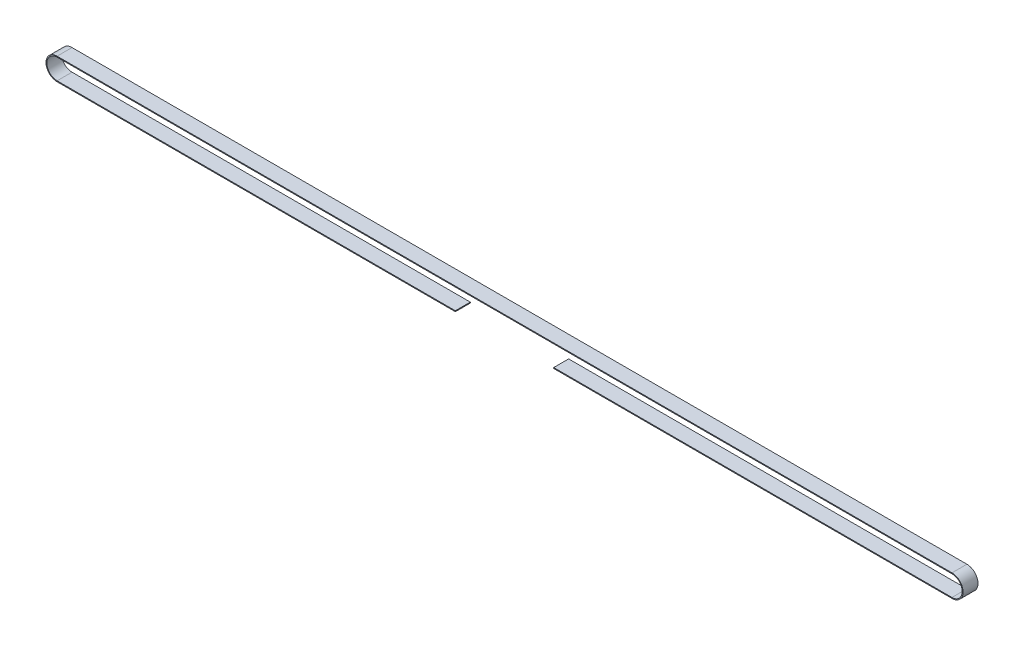
ISO-10303-21;
HEADER;
FILE_DESCRIPTION(('STEP AP214'),'2;1');
FILE_NAME('part.step','',(''),(''),'','','');
FILE_SCHEMA(('AUTOMOTIVE_DESIGN { 1 0 10303 214 1 1 1 1 }'));
ENDSEC;
DATA;
#1=APPLICATION_CONTEXT('core data for automotive mechanical design processes');
#2=APPLICATION_PROTOCOL_DEFINITION('international standard','automotive_design',2000,#1);
#3=PRODUCT_CONTEXT('',#1,'mechanical');
#4=PRODUCT('Part','Part','',(#3));
#5=PRODUCT_RELATED_PRODUCT_CATEGORY('part','',(#4));
#6=PRODUCT_DEFINITION_FORMATION('','',#4);
#7=PRODUCT_DEFINITION_CONTEXT('part definition',#1,'design');
#8=PRODUCT_DEFINITION('design','',#6,#7);
#9=PRODUCT_DEFINITION_SHAPE('','',#8);
#10=(LENGTH_UNIT() NAMED_UNIT(*) SI_UNIT(.MILLI.,.METRE.));
#11=(NAMED_UNIT(*) PLANE_ANGLE_UNIT() SI_UNIT($,.RADIAN.));
#12=(NAMED_UNIT(*) SI_UNIT($,.STERADIAN.) SOLID_ANGLE_UNIT());
#13=UNCERTAINTY_MEASURE_WITH_UNIT(LENGTH_MEASURE(1.E-05),#10,'distance_accuracy_value','');
#14=(GEOMETRIC_REPRESENTATION_CONTEXT(3) GLOBAL_UNCERTAINTY_ASSIGNED_CONTEXT((#13)) GLOBAL_UNIT_ASSIGNED_CONTEXT((#10,
#11,#12)) REPRESENTATION_CONTEXT('',''));
#15=CARTESIAN_POINT('',(0.,0.,0.));
#16=DIRECTION('',(0.,0.,1.));
#17=DIRECTION('',(1.,0.,0.));
#18=AXIS2_PLACEMENT_3D('',#15,#16,#17);
#19=CARTESIAN_POINT('',(-254.75,-6.32000000000019,4.25));
#20=DIRECTION('',(0.,1.,0.));
#21=DIRECTION('',(0.,0.,1.));
#22=AXIS2_PLACEMENT_3D('',#19,#20,#21);
#23=PLANE('',#22);
#24=DIRECTION('',(1.,0.,0.));
#25=VECTOR('',#24,1.);
#26=CARTESIAN_POINT('',(-254.75,-6.32000000000019,-4.25));
#27=LINE('',#26,#25);
#28=CARTESIAN_POINT('',(-254.75,-6.32000000000019,-4.25));
#29=VERTEX_POINT('',#28);
#30=CARTESIAN_POINT('',(-28.,-6.32000000000019,-4.25));
#31=VERTEX_POINT('',#30);
#32=EDGE_CURVE('E144',#29,#31,#27,.T.);
#33=ORIENTED_EDGE('',*,*,#32,.T.);
#34=DIRECTION('',(0.,0.,1.));
#35=VECTOR('',#34,1.);
#36=CARTESIAN_POINT('',(-28.,-6.32000000000019,4.25));
#37=LINE('',#36,#35);
#38=CARTESIAN_POINT('',(-28.,-6.32000000000019,4.25));
#39=VERTEX_POINT('',#38);
#40=EDGE_CURVE('E55',#31,#39,#37,.T.);
#41=ORIENTED_EDGE('',*,*,#40,.T.);
#42=DIRECTION('',(1.,0.,0.));
#43=VECTOR('',#42,1.);
#44=CARTESIAN_POINT('',(-254.75,-6.32000000000019,4.25));
#45=LINE('',#44,#43);
#46=CARTESIAN_POINT('',(-254.75,-6.32000000000019,4.25));
#47=VERTEX_POINT('',#46);
#48=EDGE_CURVE('E143',#47,#39,#45,.T.);
#49=ORIENTED_EDGE('',*,*,#48,.F.);
#50=DIRECTION('',(0.,0.,1.));
#51=VECTOR('',#50,1.);
#52=CARTESIAN_POINT('',(-254.75,-6.32000000000019,4.25));
#53=LINE('',#52,#51);
#54=EDGE_CURVE('E225',#29,#47,#53,.T.);
#55=ORIENTED_EDGE('',*,*,#54,.F.);
#56=EDGE_LOOP('',(#33,#41,#49,#55));
#57=FACE_BOUND('',#56,.T.);
#58=ADVANCED_FACE('F33',(#57),#23,.F.);
#59=CARTESIAN_POINT('',(-254.75,-5.82000000000019,4.25));
#60=DIRECTION('',(0.,-1.,0.));
#61=DIRECTION('',(0.,0.,-1.));
#62=AXIS2_PLACEMENT_3D('',#59,#60,#61);
#63=PLANE('',#62);
#64=DIRECTION('',(1.,0.,0.));
#65=VECTOR('',#64,1.);
#66=CARTESIAN_POINT('',(-254.75,-5.82000000000019,4.25));
#67=LINE('',#66,#65);
#68=CARTESIAN_POINT('',(-254.75,-5.82000000000019,4.25));
#69=VERTEX_POINT('',#68);
#70=CARTESIAN_POINT('',(-28.,-5.82000000000019,4.25));
#71=VERTEX_POINT('',#70);
#72=EDGE_CURVE('E206',#69,#71,#67,.T.);
#73=ORIENTED_EDGE('',*,*,#72,.T.);
#74=DIRECTION('',(0.,0.,-1.));
#75=VECTOR('',#74,1.);
#76=CARTESIAN_POINT('',(-28.,-5.82000000000019,4.25));
#77=LINE('',#76,#75);
#78=CARTESIAN_POINT('',(-28.,-5.82000000000019,-4.25));
#79=VERTEX_POINT('',#78);
#80=EDGE_CURVE('E126',#71,#79,#77,.T.);
#81=ORIENTED_EDGE('',*,*,#80,.T.);
#82=DIRECTION('',(1.,0.,0.));
#83=VECTOR('',#82,1.);
#84=CARTESIAN_POINT('',(-254.75,-5.82000000000019,-4.25));
#85=LINE('',#84,#83);
#86=CARTESIAN_POINT('',(-254.75,-5.82000000000019,-4.25));
#87=VERTEX_POINT('',#86);
#88=EDGE_CURVE('E205',#87,#79,#85,.T.);
#89=ORIENTED_EDGE('',*,*,#88,.F.);
#90=DIRECTION('',(0.,0.,-1.));
#91=VECTOR('',#90,1.);
#92=CARTESIAN_POINT('',(-254.75,-5.82000000000019,4.25));
#93=LINE('',#92,#91);
#94=EDGE_CURVE('E171',#69,#87,#93,.T.);
#95=ORIENTED_EDGE('',*,*,#94,.F.);
#96=EDGE_LOOP('',(#73,#81,#89,#95));
#97=FACE_BOUND('',#96,.T.);
#98=ADVANCED_FACE('F248',(#97),#63,.F.);
#99=CARTESIAN_POINT('',(254.75,0.,0.));
#100=DIRECTION('',(0.,0.,1.));
#101=DIRECTION('',(1.,0.,0.));
#102=AXIS2_PLACEMENT_3D('',#99,#100,#101);
#103=CYLINDRICAL_SURFACE('',#102,6.32000000000019);
#104=DIRECTION('',(0.,0.,1.));
#105=VECTOR('',#104,1.);
#106=CARTESIAN_POINT('',(254.75,-6.32000000000019,4.25));
#107=LINE('',#106,#105);
#108=CARTESIAN_POINT('',(254.75,-6.32000000000019,-4.25));
#109=VERTEX_POINT('',#108);
#110=CARTESIAN_POINT('',(254.75,-6.32000000000019,4.25));
#111=VERTEX_POINT('',#110);
#112=EDGE_CURVE('E142',#109,#111,#107,.T.);
#113=ORIENTED_EDGE('',*,*,#112,.F.);
#114=CARTESIAN_POINT('',(254.75,0.,-4.25));
#115=DIRECTION('',(0.,0.,1.));
#116=DIRECTION('',(1.,0.,0.));
#117=AXIS2_PLACEMENT_3D('',#114,#115,#116);
#118=CIRCLE('',#117,6.32000000000019);
#119=CARTESIAN_POINT('',(254.75,6.32000000000019,-4.25));
#120=VERTEX_POINT('',#119);
#121=EDGE_CURVE('E164',#109,#120,#118,.T.);
#122=ORIENTED_EDGE('',*,*,#121,.T.);
#123=DIRECTION('',(0.,0.,1.));
#124=VECTOR('',#123,1.);
#125=CARTESIAN_POINT('',(254.75,6.32000000000019,4.25));
#126=LINE('',#125,#124);
#127=CARTESIAN_POINT('',(254.75,6.32000000000019,4.25));
#128=VERTEX_POINT('',#127);
#129=EDGE_CURVE('E155',#120,#128,#126,.T.);
#130=ORIENTED_EDGE('',*,*,#129,.T.);
#131=CARTESIAN_POINT('',(254.75,0.,4.25));
#132=DIRECTION('',(0.,0.,1.));
#133=DIRECTION('',(1.,0.,0.));
#134=AXIS2_PLACEMENT_3D('',#131,#132,#133);
#135=CIRCLE('',#134,6.32000000000019);
#136=EDGE_CURVE('E167',#111,#128,#135,.T.);
#137=ORIENTED_EDGE('',*,*,#136,.F.);
#138=EDGE_LOOP('',(#113,#122,#130,#137));
#139=FACE_BOUND('',#138,.T.);
#140=ADVANCED_FACE('F35',(#139),#103,.T.);
#141=CARTESIAN_POINT('',(254.75,0.,0.));
#142=DIRECTION('',(0.,0.,1.));
#143=DIRECTION('',(1.,0.,0.));
#144=AXIS2_PLACEMENT_3D('',#141,#142,#143);
#145=CYLINDRICAL_SURFACE('',#144,5.82000000000019);
#146=DIRECTION('',(0.,0.,-1.));
#147=VECTOR('',#146,1.);
#148=CARTESIAN_POINT('',(254.75,-5.82000000000019,4.25));
#149=LINE('',#148,#147);
#150=CARTESIAN_POINT('',(254.75,-5.82000000000019,4.25));
#151=VERTEX_POINT('',#150);
#152=CARTESIAN_POINT('',(254.75,-5.82000000000019,-4.25));
#153=VERTEX_POINT('',#152);
#154=EDGE_CURVE('E212',#151,#153,#149,.T.);
#155=ORIENTED_EDGE('',*,*,#154,.F.);
#156=CARTESIAN_POINT('',(254.75,0.,4.25));
#157=DIRECTION('',(0.,0.,1.));
#158=DIRECTION('',(1.,0.,0.));
#159=AXIS2_PLACEMENT_3D('',#156,#157,#158);
#160=CIRCLE('',#159,5.82000000000019);
#161=CARTESIAN_POINT('',(254.75,5.82000000000019,4.25));
#162=VERTEX_POINT('',#161);
#163=EDGE_CURVE('E158',#151,#162,#160,.T.);
#164=ORIENTED_EDGE('',*,*,#163,.T.);
#165=DIRECTION('',(0.,0.,-1.));
#166=VECTOR('',#165,1.);
#167=CARTESIAN_POINT('',(254.75,5.82000000000019,4.25));
#168=LINE('',#167,#166);
#169=CARTESIAN_POINT('',(254.75,5.82000000000019,-4.25));
#170=VERTEX_POINT('',#169);
#171=EDGE_CURVE('E147',#162,#170,#168,.T.);
#172=ORIENTED_EDGE('',*,*,#171,.T.);
#173=CARTESIAN_POINT('',(254.75,0.,-4.25));
#174=DIRECTION('',(0.,0.,1.));
#175=DIRECTION('',(1.,0.,0.));
#176=AXIS2_PLACEMENT_3D('',#173,#174,#175);
#177=CIRCLE('',#176,5.82000000000019);
#178=EDGE_CURVE('E161',#153,#170,#177,.T.);
#179=ORIENTED_EDGE('',*,*,#178,.F.);
#180=EDGE_LOOP('',(#155,#164,#172,#179));
#181=FACE_BOUND('',#180,.T.);
#182=ADVANCED_FACE('F199',(#181),#145,.F.);
#183=CARTESIAN_POINT('',(28.,-6.32000000000019,4.25));
#184=VERTEX_POINT('',#183);
#185=EDGE_CURVE('E133',#184,#111,#45,.T.);
#186=ORIENTED_EDGE('',*,*,#185,.F.);
#187=DIRECTION('',(0.,0.,-1.));
#188=VECTOR('',#187,1.);
#189=CARTESIAN_POINT('',(28.,-6.32000000000019,4.25));
#190=LINE('',#189,#188);
#191=CARTESIAN_POINT('',(28.,-6.32000000000019,-4.25));
#192=VERTEX_POINT('',#191);
#193=EDGE_CURVE('E119',#184,#192,#190,.T.);
#194=ORIENTED_EDGE('',*,*,#193,.T.);
#195=EDGE_CURVE('E149',#192,#109,#27,.T.);
#196=ORIENTED_EDGE('',*,*,#195,.T.);
#197=ORIENTED_EDGE('',*,*,#112,.T.);
#198=EDGE_LOOP('',(#186,#194,#196,#197));
#199=FACE_BOUND('',#198,.T.);
#200=ADVANCED_FACE('F140',(#199),#23,.F.);
#201=CARTESIAN_POINT('',(28.,-5.82000000000019,-4.25));
#202=VERTEX_POINT('',#201);
#203=EDGE_CURVE('E203',#202,#153,#85,.T.);
#204=ORIENTED_EDGE('',*,*,#203,.F.);
#205=DIRECTION('',(0.,0.,1.));
#206=VECTOR('',#205,1.);
#207=CARTESIAN_POINT('',(28.,-5.82000000000019,4.25));
#208=LINE('',#207,#206);
#209=CARTESIAN_POINT('',(28.,-5.82000000000019,4.25));
#210=VERTEX_POINT('',#209);
#211=EDGE_CURVE('E48',#202,#210,#208,.T.);
#212=ORIENTED_EDGE('',*,*,#211,.T.);
#213=EDGE_CURVE('E136',#210,#151,#67,.T.);
#214=ORIENTED_EDGE('',*,*,#213,.T.);
#215=ORIENTED_EDGE('',*,*,#154,.T.);
#216=EDGE_LOOP('',(#204,#212,#214,#215));
#217=FACE_BOUND('',#216,.T.);
#218=ADVANCED_FACE('F260',(#217),#63,.F.);
#219=CARTESIAN_POINT('',(-254.75,0.,0.));
#220=DIRECTION('',(0.,0.,1.));
#221=DIRECTION('',(1.,0.,0.));
#222=AXIS2_PLACEMENT_3D('',#219,#220,#221);
#223=CYLINDRICAL_SURFACE('',#222,6.32000000000009);
#224=DIRECTION('',(0.,0.,1.));
#225=VECTOR('',#224,1.);
#226=CARTESIAN_POINT('',(-254.75,6.32,4.25));
#227=LINE('',#226,#225);
#228=CARTESIAN_POINT('',(-254.75,6.32,-4.25));
#229=VERTEX_POINT('',#228);
#230=CARTESIAN_POINT('',(-254.75,6.32,4.25));
#231=VERTEX_POINT('',#230);
#232=EDGE_CURVE('E178',#229,#231,#227,.T.);
#233=ORIENTED_EDGE('',*,*,#232,.F.);
#234=CARTESIAN_POINT('',(-254.75,0.,-4.25));
#235=DIRECTION('',(0.,0.,1.));
#236=DIRECTION('',(1.,0.,0.));
#237=AXIS2_PLACEMENT_3D('',#234,#235,#236);
#238=CIRCLE('',#237,6.32000000000009);
#239=EDGE_CURVE('E217',#229,#29,#238,.T.);
#240=ORIENTED_EDGE('',*,*,#239,.T.);
#241=ORIENTED_EDGE('',*,*,#54,.T.);
#242=CARTESIAN_POINT('',(-254.75,0.,4.25));
#243=DIRECTION('',(0.,0.,1.));
#244=DIRECTION('',(1.,0.,0.));
#245=AXIS2_PLACEMENT_3D('',#242,#243,#244);
#246=CIRCLE('',#245,6.32000000000009);
#247=EDGE_CURVE('E214',#231,#47,#246,.T.);
#248=ORIENTED_EDGE('',*,*,#247,.F.);
#249=EDGE_LOOP('',(#233,#240,#241,#248));
#250=FACE_BOUND('',#249,.T.);
#251=ADVANCED_FACE('F243',(#250),#223,.T.);
#252=CARTESIAN_POINT('',(-254.75,0.,0.));
#253=DIRECTION('',(0.,0.,1.));
#254=DIRECTION('',(1.,0.,0.));
#255=AXIS2_PLACEMENT_3D('',#252,#253,#254);
#256=CYLINDRICAL_SURFACE('',#255,5.82000000000009);
#257=DIRECTION('',(0.,0.,-1.));
#258=VECTOR('',#257,1.);
#259=CARTESIAN_POINT('',(-254.75,5.82,4.25));
#260=LINE('',#259,#258);
#261=CARTESIAN_POINT('',(-254.75,5.82,4.25));
#262=VERTEX_POINT('',#261);
#263=CARTESIAN_POINT('',(-254.75,5.82,-4.25));
#264=VERTEX_POINT('',#263);
#265=EDGE_CURVE('E193',#262,#264,#260,.T.);
#266=ORIENTED_EDGE('',*,*,#265,.F.);
#267=CARTESIAN_POINT('',(-254.75,0.,4.25));
#268=DIRECTION('',(0.,0.,1.));
#269=DIRECTION('',(1.,0.,0.));
#270=AXIS2_PLACEMENT_3D('',#267,#268,#269);
#271=CIRCLE('',#270,5.82000000000009);
#272=EDGE_CURVE('E222',#262,#69,#271,.T.);
#273=ORIENTED_EDGE('',*,*,#272,.T.);
#274=ORIENTED_EDGE('',*,*,#94,.T.);
#275=CARTESIAN_POINT('',(-254.75,0.,-4.25));
#276=DIRECTION('',(0.,0.,1.));
#277=DIRECTION('',(1.,0.,0.));
#278=AXIS2_PLACEMENT_3D('',#275,#276,#277);
#279=CIRCLE('',#278,5.82000000000009);
#280=EDGE_CURVE('E220',#264,#87,#279,.T.);
#281=ORIENTED_EDGE('',*,*,#280,.F.);
#282=EDGE_LOOP('',(#266,#273,#274,#281));
#283=FACE_BOUND('',#282,.T.);
#284=ADVANCED_FACE('F251',(#283),#256,.F.);
#285=CARTESIAN_POINT('',(-254.75,6.32,4.25));
#286=DIRECTION('',(0.,0.,1.));
#287=DIRECTION('',(1.,0.,0.));
#288=AXIS2_PLACEMENT_3D('',#285,#286,#287);
#289=PLANE('',#288);
#290=DIRECTION('',(0.,-1.,0.));
#291=VECTOR('',#290,1.);
#292=CARTESIAN_POINT('',(-28.,-40.,4.25));
#293=LINE('',#292,#291);
#294=EDGE_CURVE('E137',#71,#39,#293,.T.);
#295=ORIENTED_EDGE('',*,*,#294,.F.);
#296=ORIENTED_EDGE('',*,*,#72,.F.);
#297=ORIENTED_EDGE('',*,*,#272,.F.);
#298=DIRECTION('',(1.,0.,0.));
#299=VECTOR('',#298,1.);
#300=CARTESIAN_POINT('',(-254.75,5.82,4.25));
#301=LINE('',#300,#299);
#302=EDGE_CURVE('E175',#262,#162,#301,.T.);
#303=ORIENTED_EDGE('',*,*,#302,.T.);
#304=ORIENTED_EDGE('',*,*,#163,.F.);
#305=ORIENTED_EDGE('',*,*,#213,.F.);
#306=DIRECTION('',(0.,1.,0.));
#307=VECTOR('',#306,1.);
#308=CARTESIAN_POINT('',(28.,-40.,4.25));
#309=LINE('',#308,#307);
#310=EDGE_CURVE('E122',#184,#210,#309,.T.);
#311=ORIENTED_EDGE('',*,*,#310,.F.);
#312=ORIENTED_EDGE('',*,*,#185,.T.);
#313=ORIENTED_EDGE('',*,*,#136,.T.);
#314=DIRECTION('',(1.,0.,0.));
#315=VECTOR('',#314,1.);
#316=CARTESIAN_POINT('',(-254.75,6.32,4.25));
#317=LINE('',#316,#315);
#318=EDGE_CURVE('E169',#231,#128,#317,.T.);
#319=ORIENTED_EDGE('',*,*,#318,.F.);
#320=ORIENTED_EDGE('',*,*,#247,.T.);
#321=ORIENTED_EDGE('',*,*,#48,.T.);
#322=EDGE_LOOP('',(#295,#296,#297,#303,#304,#305,#311,#312,#313,#319,#320,#321));
#323=FACE_BOUND('',#322,.T.);
#324=ADVANCED_FACE('F131',(#323),#289,.T.);
#325=CARTESIAN_POINT('',(-254.75,6.32,4.25));
#326=DIRECTION('',(0.,1.,0.));
#327=DIRECTION('',(0.,0.,1.));
#328=AXIS2_PLACEMENT_3D('',#325,#326,#327);
#329=PLANE('',#328);
#330=ORIENTED_EDGE('',*,*,#318,.T.);
#331=ORIENTED_EDGE('',*,*,#129,.F.);
#332=DIRECTION('',(1.,0.,0.));
#333=VECTOR('',#332,1.);
#334=CARTESIAN_POINT('',(-254.75,6.32,-4.25));
#335=LINE('',#334,#333);
#336=EDGE_CURVE('E172',#229,#120,#335,.T.);
#337=ORIENTED_EDGE('',*,*,#336,.F.);
#338=ORIENTED_EDGE('',*,*,#232,.T.);
#339=EDGE_LOOP('',(#330,#331,#337,#338));
#340=FACE_BOUND('',#339,.T.);
#341=ADVANCED_FACE('F258',(#340),#329,.T.);
#342=CARTESIAN_POINT('',(-254.75,6.32,-4.25));
#343=DIRECTION('',(0.,0.,-1.));
#344=DIRECTION('',(-1.,0.,0.));
#345=AXIS2_PLACEMENT_3D('',#342,#343,#344);
#346=PLANE('',#345);
#347=DIRECTION('',(0.,1.,0.));
#348=VECTOR('',#347,1.);
#349=CARTESIAN_POINT('',(-28.,6.32000000000008,-4.25));
#350=LINE('',#349,#348);
#351=EDGE_CURVE('E11',#31,#79,#350,.T.);
#352=ORIENTED_EDGE('',*,*,#351,.F.);
#353=ORIENTED_EDGE('',*,*,#32,.F.);
#354=ORIENTED_EDGE('',*,*,#239,.F.);
#355=ORIENTED_EDGE('',*,*,#336,.T.);
#356=ORIENTED_EDGE('',*,*,#121,.F.);
#357=ORIENTED_EDGE('',*,*,#195,.F.);
#358=DIRECTION('',(0.,-1.,0.));
#359=VECTOR('',#358,1.);
#360=CARTESIAN_POINT('',(28.,6.32,-4.25));
#361=LINE('',#360,#359);
#362=EDGE_CURVE('E41',#202,#192,#361,.T.);
#363=ORIENTED_EDGE('',*,*,#362,.F.);
#364=ORIENTED_EDGE('',*,*,#203,.T.);
#365=ORIENTED_EDGE('',*,*,#178,.T.);
#366=DIRECTION('',(1.,0.,0.));
#367=VECTOR('',#366,1.);
#368=CARTESIAN_POINT('',(-254.75,5.82,-4.25));
#369=LINE('',#368,#367);
#370=EDGE_CURVE('E177',#264,#170,#369,.T.);
#371=ORIENTED_EDGE('',*,*,#370,.F.);
#372=ORIENTED_EDGE('',*,*,#280,.T.);
#373=ORIENTED_EDGE('',*,*,#88,.T.);
#374=EDGE_LOOP('',(#352,#353,#354,#355,#356,#357,#363,#364,#365,#371,#372,#373));
#375=FACE_BOUND('',#374,.T.);
#376=ADVANCED_FACE('F201',(#375),#346,.T.);
#377=CARTESIAN_POINT('',(-254.75,5.82,4.25));
#378=DIRECTION('',(0.,-1.,0.));
#379=DIRECTION('',(1.,0.,0.));
#380=AXIS2_PLACEMENT_3D('',#377,#378,#379);
#381=PLANE('',#380);
#382=ORIENTED_EDGE('',*,*,#370,.T.);
#383=ORIENTED_EDGE('',*,*,#171,.F.);
#384=ORIENTED_EDGE('',*,*,#302,.F.);
#385=ORIENTED_EDGE('',*,*,#265,.T.);
#386=EDGE_LOOP('',(#382,#383,#384,#385));
#387=FACE_BOUND('',#386,.T.);
#388=ADVANCED_FACE('F190',(#387),#381,.T.);
#389=CARTESIAN_POINT('',(28.,-40.,-4.25));
#390=DIRECTION('',(1.,0.,0.));
#391=DIRECTION('',(0.,0.,-1.));
#392=AXIS2_PLACEMENT_3D('',#389,#390,#391);
#393=PLANE('',#392);
#394=ORIENTED_EDGE('',*,*,#310,.T.);
#395=ORIENTED_EDGE('',*,*,#211,.F.);
#396=ORIENTED_EDGE('',*,*,#362,.T.);
#397=ORIENTED_EDGE('',*,*,#193,.F.);
#398=EDGE_LOOP('',(#394,#395,#396,#397));
#399=FACE_BOUND('',#398,.T.);
#400=ADVANCED_FACE('F121',(#399),#393,.F.);
#401=CARTESIAN_POINT('',(-28.,-40.,-4.25));
#402=DIRECTION('',(-1.,0.,0.));
#403=DIRECTION('',(0.,-1.,0.));
#404=AXIS2_PLACEMENT_3D('',#401,#402,#403);
#405=PLANE('',#404);
#406=ORIENTED_EDGE('',*,*,#351,.T.);
#407=ORIENTED_EDGE('',*,*,#80,.F.);
#408=ORIENTED_EDGE('',*,*,#294,.T.);
#409=ORIENTED_EDGE('',*,*,#40,.F.);
#410=EDGE_LOOP('',(#406,#407,#408,#409));
#411=FACE_BOUND('',#410,.T.);
#412=ADVANCED_FACE('F237',(#411),#405,.F.);
#413=CLOSED_SHELL('',(#58,#98,#140,#182,#200,#218,#251,#284,#324,#341,#376,#388,#400,#412));
#414=MANIFOLD_SOLID_BREP('B2',#413);
#415=ADVANCED_BREP_SHAPE_REPRESENTATION('',(#18,#414),#14);
#416=SHAPE_DEFINITION_REPRESENTATION(#9,#415);
ENDSEC;
END-ISO-10303-21;
